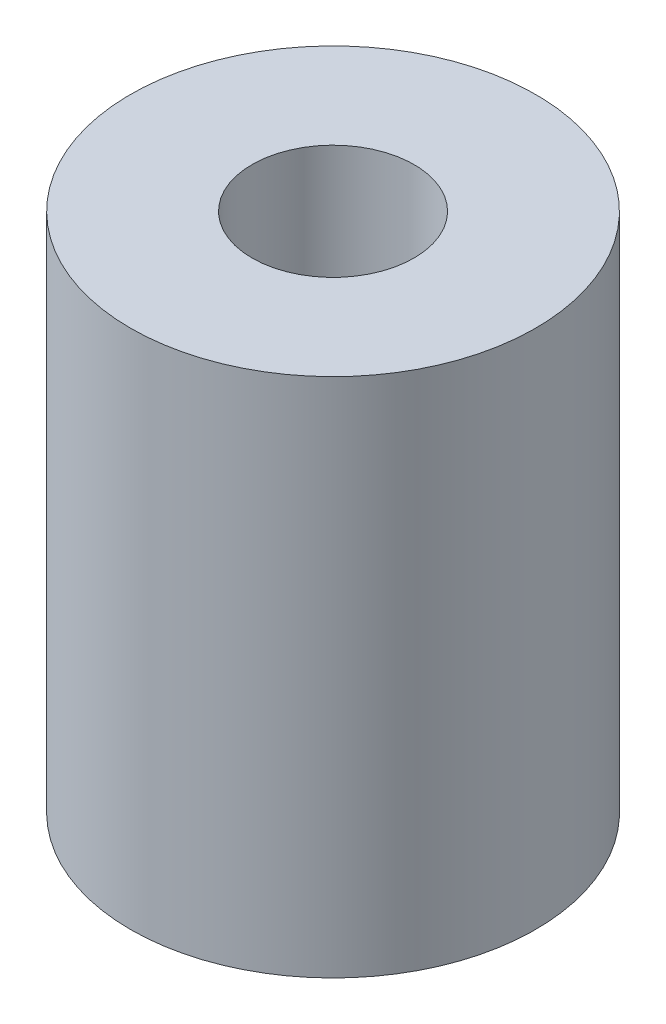
ISO-10303-21;
HEADER;
FILE_DESCRIPTION(('STEP AP214'),'2;1');
FILE_NAME('part.step','',(''),(''),'','','');
FILE_SCHEMA(('AUTOMOTIVE_DESIGN { 1 0 10303 214 1 1 1 1 }'));
ENDSEC;
DATA;
#1=APPLICATION_CONTEXT('core data for automotive mechanical design processes');
#2=APPLICATION_PROTOCOL_DEFINITION('international standard','automotive_design',2000,#1);
#3=PRODUCT_CONTEXT('',#1,'mechanical');
#4=PRODUCT('Part','Part','',(#3));
#5=PRODUCT_RELATED_PRODUCT_CATEGORY('part','',(#4));
#6=PRODUCT_DEFINITION_FORMATION('','',#4);
#7=PRODUCT_DEFINITION_CONTEXT('part definition',#1,'design');
#8=PRODUCT_DEFINITION('design','',#6,#7);
#9=PRODUCT_DEFINITION_SHAPE('','',#8);
#10=(LENGTH_UNIT() NAMED_UNIT(*) SI_UNIT(.MILLI.,.METRE.));
#11=(NAMED_UNIT(*) PLANE_ANGLE_UNIT() SI_UNIT($,.RADIAN.));
#12=(NAMED_UNIT(*) SI_UNIT($,.STERADIAN.) SOLID_ANGLE_UNIT());
#13=UNCERTAINTY_MEASURE_WITH_UNIT(LENGTH_MEASURE(1.E-05),#10,'distance_accuracy_value','');
#14=(GEOMETRIC_REPRESENTATION_CONTEXT(3) GLOBAL_UNCERTAINTY_ASSIGNED_CONTEXT((#13)) GLOBAL_UNIT_ASSIGNED_CONTEXT((#10,
#11,#12)) REPRESENTATION_CONTEXT('',''));
#15=CARTESIAN_POINT('',(0.,0.,0.));
#16=DIRECTION('',(0.,0.,1.));
#17=DIRECTION('',(1.,0.,0.));
#18=AXIS2_PLACEMENT_3D('',#15,#16,#17);
#19=CARTESIAN_POINT('',(0.,9.,0.));
#20=DIRECTION('',(0.,-1.,0.));
#21=DIRECTION('',(0.,0.,-1.));
#22=AXIS2_PLACEMENT_3D('',#19,#20,#21);
#23=CYLINDRICAL_SURFACE('',#22,3.5);
#24=CARTESIAN_POINT('',(0.,9.,0.));
#25=DIRECTION('',(0.,1.,0.));
#26=DIRECTION('',(0.,0.,1.));
#27=AXIS2_PLACEMENT_3D('',#24,#25,#26);
#28=CIRCLE('',#27,3.5);
#29=CARTESIAN_POINT('',(0.,9.,3.5));
#30=VERTEX_POINT('',#29);
#31=EDGE_CURVE('E10',#30,#30,#28,.T.);
#32=ORIENTED_EDGE('',*,*,#31,.F.);
#33=EDGE_LOOP('',(#32));
#34=FACE_BOUND('',#33,.T.);
#35=CARTESIAN_POINT('',(0.,0.,0.));
#36=DIRECTION('',(0.,1.,0.));
#37=DIRECTION('',(0.,0.,1.));
#38=AXIS2_PLACEMENT_3D('',#35,#36,#37);
#39=CIRCLE('',#38,3.5);
#40=CARTESIAN_POINT('',(0.,0.,3.5));
#41=VERTEX_POINT('',#40);
#42=EDGE_CURVE('E46',#41,#41,#39,.T.);
#43=ORIENTED_EDGE('',*,*,#42,.T.);
#44=EDGE_LOOP('',(#43));
#45=FACE_BOUND('',#44,.T.);
#46=ADVANCED_FACE('F43',(#34,#45),#23,.T.);
#47=CARTESIAN_POINT('',(0.,9.,0.));
#48=DIRECTION('',(0.,1.,0.));
#49=DIRECTION('',(0.,0.,1.));
#50=AXIS2_PLACEMENT_3D('',#47,#48,#49);
#51=PLANE('',#50);
#52=CARTESIAN_POINT('',(0.,9.,0.));
#53=DIRECTION('',(0.,1.,0.));
#54=DIRECTION('',(0.,0.,1.));
#55=AXIS2_PLACEMENT_3D('',#52,#53,#54);
#56=CIRCLE('',#55,1.4);
#57=CARTESIAN_POINT('',(0.,9.,1.4));
#58=VERTEX_POINT('',#57);
#59=EDGE_CURVE('E57',#58,#58,#56,.T.);
#60=ORIENTED_EDGE('',*,*,#59,.F.);
#61=EDGE_LOOP('',(#60));
#62=FACE_BOUND('',#61,.T.);
#63=ORIENTED_EDGE('',*,*,#31,.T.);
#64=EDGE_LOOP('',(#63));
#65=FACE_BOUND('',#64,.T.);
#66=ADVANCED_FACE('F74',(#62,#65),#51,.T.);
#67=CARTESIAN_POINT('',(0.,0.,0.));
#68=DIRECTION('',(0.,1.,0.));
#69=DIRECTION('',(0.,0.,1.));
#70=AXIS2_PLACEMENT_3D('',#67,#68,#69);
#71=PLANE('',#70);
#72=CARTESIAN_POINT('',(0.,0.,0.));
#73=DIRECTION('',(0.,1.,0.));
#74=DIRECTION('',(0.,0.,1.));
#75=AXIS2_PLACEMENT_3D('',#72,#73,#74);
#76=CIRCLE('',#75,1.4);
#77=CARTESIAN_POINT('',(0.,0.,1.4));
#78=VERTEX_POINT('',#77);
#79=EDGE_CURVE('E55',#78,#78,#76,.T.);
#80=ORIENTED_EDGE('',*,*,#79,.T.);
#81=EDGE_LOOP('',(#80));
#82=FACE_BOUND('',#81,.T.);
#83=ORIENTED_EDGE('',*,*,#42,.F.);
#84=EDGE_LOOP('',(#83));
#85=FACE_BOUND('',#84,.T.);
#86=ADVANCED_FACE('F65',(#82,#85),#71,.F.);
#87=CARTESIAN_POINT('',(0.,0.,0.));
#88=DIRECTION('',(0.,1.,0.));
#89=DIRECTION('',(0.,0.,1.));
#90=AXIS2_PLACEMENT_3D('',#87,#88,#89);
#91=CYLINDRICAL_SURFACE('',#90,1.4);
#92=ORIENTED_EDGE('',*,*,#79,.F.);
#93=EDGE_LOOP('',(#92));
#94=FACE_BOUND('',#93,.T.);
#95=ORIENTED_EDGE('',*,*,#59,.T.);
#96=EDGE_LOOP('',(#95));
#97=FACE_BOUND('',#96,.T.);
#98=ADVANCED_FACE('F68',(#94,#97),#91,.F.);
#99=CLOSED_SHELL('',(#46,#66,#86,#98));
#100=MANIFOLD_SOLID_BREP('B2',#99);
#101=ADVANCED_BREP_SHAPE_REPRESENTATION('',(#18,#100),#14);
#102=SHAPE_DEFINITION_REPRESENTATION(#9,#101);
ENDSEC;
END-ISO-10303-21;
